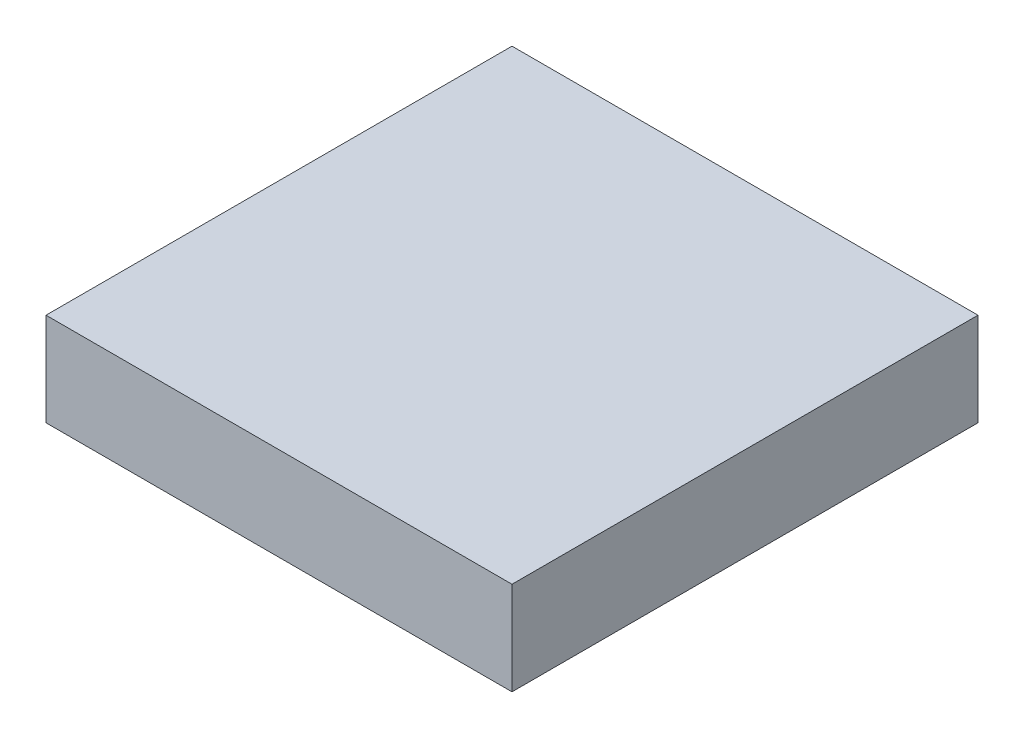
ISO-10303-21;
HEADER;
FILE_DESCRIPTION(('STEP AP214'),'2;1');
FILE_NAME('part.step','',(''),(''),'','','');
FILE_SCHEMA(('AUTOMOTIVE_DESIGN { 1 0 10303 214 1 1 1 1 }'));
ENDSEC;
DATA;
#1=APPLICATION_CONTEXT('core data for automotive mechanical design processes');
#2=APPLICATION_PROTOCOL_DEFINITION('international standard','automotive_design',2000,#1);
#3=PRODUCT_CONTEXT('',#1,'mechanical');
#4=PRODUCT('Part','Part','',(#3));
#5=PRODUCT_RELATED_PRODUCT_CATEGORY('part','',(#4));
#6=PRODUCT_DEFINITION_FORMATION('','',#4);
#7=PRODUCT_DEFINITION_CONTEXT('part definition',#1,'design');
#8=PRODUCT_DEFINITION('design','',#6,#7);
#9=PRODUCT_DEFINITION_SHAPE('','',#8);
#10=(LENGTH_UNIT() NAMED_UNIT(*) SI_UNIT(.MILLI.,.METRE.));
#11=(NAMED_UNIT(*) PLANE_ANGLE_UNIT() SI_UNIT($,.RADIAN.));
#12=(NAMED_UNIT(*) SI_UNIT($,.STERADIAN.) SOLID_ANGLE_UNIT());
#13=UNCERTAINTY_MEASURE_WITH_UNIT(LENGTH_MEASURE(1.E-05),#10,'distance_accuracy_value','');
#14=(GEOMETRIC_REPRESENTATION_CONTEXT(3) GLOBAL_UNCERTAINTY_ASSIGNED_CONTEXT((#13)) GLOBAL_UNIT_ASSIGNED_CONTEXT((#10,
#11,#12)) REPRESENTATION_CONTEXT('',''));
#15=CARTESIAN_POINT('',(0.,0.,0.));
#16=DIRECTION('',(0.,0.,1.));
#17=DIRECTION('',(1.,0.,0.));
#18=AXIS2_PLACEMENT_3D('',#15,#16,#17);
#19=CARTESIAN_POINT('',(6.35,2.54,6.35));
#20=DIRECTION('',(-1.,0.,0.));
#21=DIRECTION('',(0.,0.,1.));
#22=AXIS2_PLACEMENT_3D('',#19,#20,#21);
#23=PLANE('',#22);
#24=DIRECTION('',(0.,0.,-1.));
#25=VECTOR('',#24,1.);
#26=CARTESIAN_POINT('',(6.35,0.,6.35));
#27=LINE('',#26,#25);
#28=CARTESIAN_POINT('',(6.35,0.,6.35));
#29=VERTEX_POINT('',#28);
#30=CARTESIAN_POINT('',(6.35,0.,-6.35));
#31=VERTEX_POINT('',#30);
#32=EDGE_CURVE('E102',#29,#31,#27,.T.);
#33=ORIENTED_EDGE('',*,*,#32,.T.);
#34=DIRECTION('',(0.,-1.,0.));
#35=VECTOR('',#34,1.);
#36=CARTESIAN_POINT('',(6.35,2.54,-6.35));
#37=LINE('',#36,#35);
#38=CARTESIAN_POINT('',(6.35,2.54,-6.35));
#39=VERTEX_POINT('',#38);
#40=EDGE_CURVE('E11',#39,#31,#37,.T.);
#41=ORIENTED_EDGE('',*,*,#40,.F.);
#42=DIRECTION('',(0.,0.,-1.));
#43=VECTOR('',#42,1.);
#44=CARTESIAN_POINT('',(6.35,2.54,6.35));
#45=LINE('',#44,#43);
#46=CARTESIAN_POINT('',(6.35,2.54,6.35));
#47=VERTEX_POINT('',#46);
#48=EDGE_CURVE('E90',#47,#39,#45,.T.);
#49=ORIENTED_EDGE('',*,*,#48,.F.);
#50=DIRECTION('',(0.,-1.,0.));
#51=VECTOR('',#50,1.);
#52=CARTESIAN_POINT('',(6.35,2.54,6.35));
#53=LINE('',#52,#51);
#54=EDGE_CURVE('E98',#47,#29,#53,.T.);
#55=ORIENTED_EDGE('',*,*,#54,.T.);
#56=EDGE_LOOP('',(#33,#41,#49,#55));
#57=FACE_BOUND('',#56,.T.);
#58=ADVANCED_FACE('F39',(#57),#23,.F.);
#59=CARTESIAN_POINT('',(-6.35,2.54,-6.35));
#60=DIRECTION('',(0.,0.,1.));
#61=DIRECTION('',(1.,0.,0.));
#62=AXIS2_PLACEMENT_3D('',#59,#60,#61);
#63=PLANE('',#62);
#64=DIRECTION('',(-1.,0.,0.));
#65=VECTOR('',#64,1.);
#66=CARTESIAN_POINT('',(-6.35,0.,-6.35));
#67=LINE('',#66,#65);
#68=CARTESIAN_POINT('',(-6.35,0.,-6.35));
#69=VERTEX_POINT('',#68);
#70=EDGE_CURVE('E94',#31,#69,#67,.T.);
#71=ORIENTED_EDGE('',*,*,#70,.T.);
#72=DIRECTION('',(0.,-1.,0.));
#73=VECTOR('',#72,1.);
#74=CARTESIAN_POINT('',(-6.35,2.54,-6.35));
#75=LINE('',#74,#73);
#76=CARTESIAN_POINT('',(-6.35,2.54,-6.35));
#77=VERTEX_POINT('',#76);
#78=EDGE_CURVE('E47',#77,#69,#75,.T.);
#79=ORIENTED_EDGE('',*,*,#78,.F.);
#80=DIRECTION('',(-1.,0.,0.));
#81=VECTOR('',#80,1.);
#82=CARTESIAN_POINT('',(-6.35,2.54,-6.35));
#83=LINE('',#82,#81);
#84=EDGE_CURVE('E85',#39,#77,#83,.T.);
#85=ORIENTED_EDGE('',*,*,#84,.F.);
#86=ORIENTED_EDGE('',*,*,#40,.T.);
#87=EDGE_LOOP('',(#71,#79,#85,#86));
#88=FACE_BOUND('',#87,.T.);
#89=ADVANCED_FACE('F93',(#88),#63,.F.);
#90=CARTESIAN_POINT('',(-6.35,2.54,6.35));
#91=DIRECTION('',(1.,0.,0.));
#92=DIRECTION('',(0.,0.,-1.));
#93=AXIS2_PLACEMENT_3D('',#90,#91,#92);
#94=PLANE('',#93);
#95=DIRECTION('',(0.,0.,1.));
#96=VECTOR('',#95,1.);
#97=CARTESIAN_POINT('',(-6.35,0.,6.35));
#98=LINE('',#97,#96);
#99=CARTESIAN_POINT('',(-6.35,0.,6.35));
#100=VERTEX_POINT('',#99);
#101=EDGE_CURVE('E72',#69,#100,#98,.T.);
#102=ORIENTED_EDGE('',*,*,#101,.T.);
#103=DIRECTION('',(0.,-1.,0.));
#104=VECTOR('',#103,1.);
#105=CARTESIAN_POINT('',(-6.35,2.54,6.35));
#106=LINE('',#105,#104);
#107=CARTESIAN_POINT('',(-6.35,2.54,6.35));
#108=VERTEX_POINT('',#107);
#109=EDGE_CURVE('E95',#108,#100,#106,.T.);
#110=ORIENTED_EDGE('',*,*,#109,.F.);
#111=DIRECTION('',(0.,0.,1.));
#112=VECTOR('',#111,1.);
#113=CARTESIAN_POINT('',(-6.35,2.54,6.35));
#114=LINE('',#113,#112);
#115=EDGE_CURVE('E88',#77,#108,#114,.T.);
#116=ORIENTED_EDGE('',*,*,#115,.F.);
#117=ORIENTED_EDGE('',*,*,#78,.T.);
#118=EDGE_LOOP('',(#102,#110,#116,#117));
#119=FACE_BOUND('',#118,.T.);
#120=ADVANCED_FACE('F96',(#119),#94,.F.);
#121=CARTESIAN_POINT('',(-6.35,2.54,6.35));
#122=DIRECTION('',(0.,0.,-1.));
#123=DIRECTION('',(-1.,0.,0.));
#124=AXIS2_PLACEMENT_3D('',#121,#122,#123);
#125=PLANE('',#124);
#126=DIRECTION('',(1.,0.,0.));
#127=VECTOR('',#126,1.);
#128=CARTESIAN_POINT('',(-6.35,0.,6.35));
#129=LINE('',#128,#127);
#130=EDGE_CURVE('E78',#100,#29,#129,.T.);
#131=ORIENTED_EDGE('',*,*,#130,.T.);
#132=ORIENTED_EDGE('',*,*,#54,.F.);
#133=DIRECTION('',(1.,0.,0.));
#134=VECTOR('',#133,1.);
#135=CARTESIAN_POINT('',(-6.35,2.54,6.35));
#136=LINE('',#135,#134);
#137=EDGE_CURVE('E55',#108,#47,#136,.T.);
#138=ORIENTED_EDGE('',*,*,#137,.F.);
#139=ORIENTED_EDGE('',*,*,#109,.T.);
#140=EDGE_LOOP('',(#131,#132,#138,#139));
#141=FACE_BOUND('',#140,.T.);
#142=ADVANCED_FACE('F109',(#141),#125,.F.);
#143=CARTESIAN_POINT('',(0.,2.54,0.));
#144=DIRECTION('',(0.,-1.,0.));
#145=DIRECTION('',(0.,0.,-1.));
#146=AXIS2_PLACEMENT_3D('',#143,#144,#145);
#147=PLANE('',#146);
#148=ORIENTED_EDGE('',*,*,#48,.T.);
#149=ORIENTED_EDGE('',*,*,#84,.T.);
#150=ORIENTED_EDGE('',*,*,#115,.T.);
#151=ORIENTED_EDGE('',*,*,#137,.T.);
#152=EDGE_LOOP('',(#148,#149,#150,#151));
#153=FACE_BOUND('',#152,.T.);
#154=ADVANCED_FACE('F86',(#153),#147,.F.);
#155=CARTESIAN_POINT('',(0.,0.,0.));
#156=DIRECTION('',(0.,-1.,0.));
#157=DIRECTION('',(0.,0.,-1.));
#158=AXIS2_PLACEMENT_3D('',#155,#156,#157);
#159=PLANE('',#158);
#160=ORIENTED_EDGE('',*,*,#32,.F.);
#161=ORIENTED_EDGE('',*,*,#130,.F.);
#162=ORIENTED_EDGE('',*,*,#101,.F.);
#163=ORIENTED_EDGE('',*,*,#70,.F.);
#164=EDGE_LOOP('',(#160,#161,#162,#163));
#165=FACE_BOUND('',#164,.T.);
#166=ADVANCED_FACE('F112',(#165),#159,.T.);
#167=CLOSED_SHELL('',(#58,#89,#120,#142,#154,#166));
#168=MANIFOLD_SOLID_BREP('B2',#167);
#169=ADVANCED_BREP_SHAPE_REPRESENTATION('',(#18,#168),#14);
#170=SHAPE_DEFINITION_REPRESENTATION(#9,#169);
ENDSEC;
END-ISO-10303-21;
